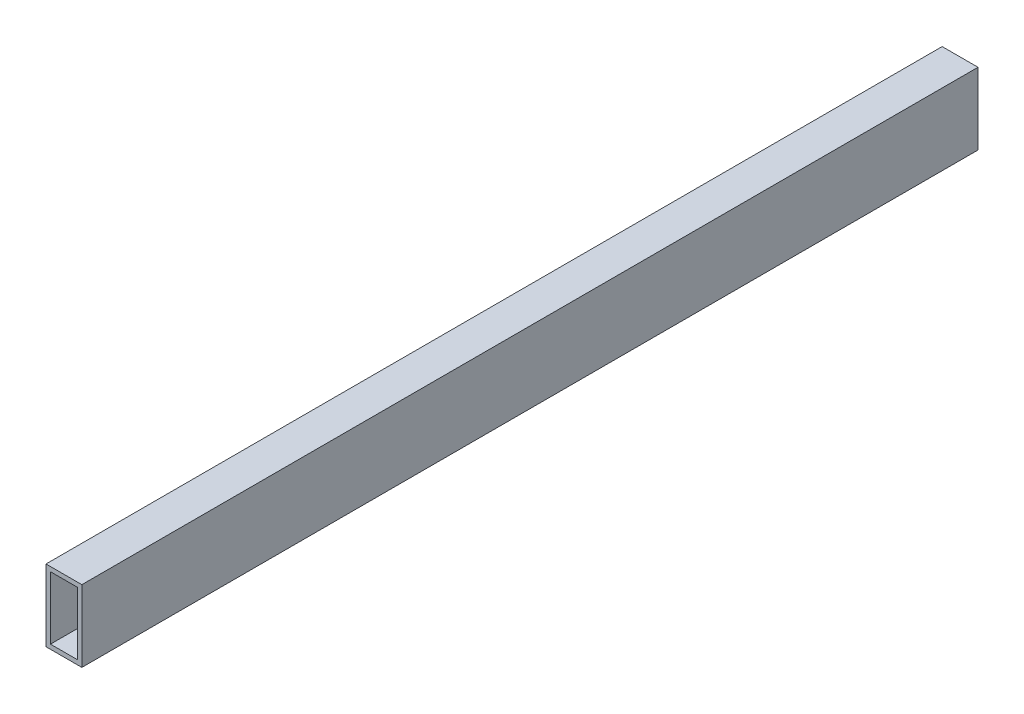
ISO-10303-21;
HEADER;
FILE_DESCRIPTION(('STEP AP214'),'2;1');
FILE_NAME('part.step','',(''),(''),'','','');
FILE_SCHEMA(('AUTOMOTIVE_DESIGN { 1 0 10303 214 1 1 1 1 }'));
ENDSEC;
DATA;
#1=APPLICATION_CONTEXT('core data for automotive mechanical design processes');
#2=APPLICATION_PROTOCOL_DEFINITION('international standard','automotive_design',2000,#1);
#3=PRODUCT_CONTEXT('',#1,'mechanical');
#4=PRODUCT('Part','Part','',(#3));
#5=PRODUCT_RELATED_PRODUCT_CATEGORY('part','',(#4));
#6=PRODUCT_DEFINITION_FORMATION('','',#4);
#7=PRODUCT_DEFINITION_CONTEXT('part definition',#1,'design');
#8=PRODUCT_DEFINITION('design','',#6,#7);
#9=PRODUCT_DEFINITION_SHAPE('','',#8);
#10=(LENGTH_UNIT() NAMED_UNIT(*) SI_UNIT(.MILLI.,.METRE.));
#11=(NAMED_UNIT(*) PLANE_ANGLE_UNIT() SI_UNIT($,.RADIAN.));
#12=(NAMED_UNIT(*) SI_UNIT($,.STERADIAN.) SOLID_ANGLE_UNIT());
#13=UNCERTAINTY_MEASURE_WITH_UNIT(LENGTH_MEASURE(1.E-05),#10,'distance_accuracy_value','');
#14=(GEOMETRIC_REPRESENTATION_CONTEXT(3) GLOBAL_UNCERTAINTY_ASSIGNED_CONTEXT((#13)) GLOBAL_UNIT_ASSIGNED_CONTEXT((#10,
#11,#12)) REPRESENTATION_CONTEXT('',''));
#15=CARTESIAN_POINT('',(0.,0.,0.));
#16=DIRECTION('',(0.,0.,1.));
#17=DIRECTION('',(1.,0.,0.));
#18=AXIS2_PLACEMENT_3D('',#15,#16,#17);
#19=CARTESIAN_POINT('',(0.,0.,635.));
#20=DIRECTION('',(0.,0.,-1.));
#21=DIRECTION('',(-1.,0.,0.));
#22=AXIS2_PLACEMENT_3D('',#19,#20,#21);
#23=PLANE('',#22);
#24=DIRECTION('',(0.,-1.,0.));
#25=VECTOR('',#24,1.);
#26=CARTESIAN_POINT('',(0.,0.,635.));
#27=LINE('',#26,#25);
#28=CARTESIAN_POINT('',(0.,50.8,635.));
#29=VERTEX_POINT('',#28);
#30=CARTESIAN_POINT('',(0.,0.,635.));
#31=VERTEX_POINT('',#30);
#32=EDGE_CURVE('E134',#29,#31,#27,.T.);
#33=ORIENTED_EDGE('',*,*,#32,.T.);
#34=DIRECTION('',(1.,0.,0.));
#35=VECTOR('',#34,1.);
#36=CARTESIAN_POINT('',(0.,0.,635.));
#37=LINE('',#36,#35);
#38=CARTESIAN_POINT('',(25.4,0.,635.));
#39=VERTEX_POINT('',#38);
#40=EDGE_CURVE('E137',#31,#39,#37,.T.);
#41=ORIENTED_EDGE('',*,*,#40,.T.);
#42=DIRECTION('',(0.,1.,0.));
#43=VECTOR('',#42,1.);
#44=CARTESIAN_POINT('',(25.4,0.,635.));
#45=LINE('',#44,#43);
#46=CARTESIAN_POINT('',(25.4,50.8,635.));
#47=VERTEX_POINT('',#46);
#48=EDGE_CURVE('E140',#39,#47,#45,.T.);
#49=ORIENTED_EDGE('',*,*,#48,.T.);
#50=DIRECTION('',(-1.,0.,0.));
#51=VECTOR('',#50,1.);
#52=CARTESIAN_POINT('',(0.,50.8,635.));
#53=LINE('',#52,#51);
#54=EDGE_CURVE('E142',#47,#29,#53,.T.);
#55=ORIENTED_EDGE('',*,*,#54,.T.);
#56=EDGE_LOOP('',(#33,#41,#49,#55));
#57=FACE_BOUND('',#56,.T.);
#58=DIRECTION('',(0.,-1.,0.));
#59=VECTOR('',#58,1.);
#60=CARTESIAN_POINT('',(3.175,3.175,635.));
#61=LINE('',#60,#59);
#62=CARTESIAN_POINT('',(3.175,47.625,635.));
#63=VERTEX_POINT('',#62);
#64=CARTESIAN_POINT('',(3.175,3.175,635.));
#65=VERTEX_POINT('',#64);
#66=EDGE_CURVE('E98',#63,#65,#61,.T.);
#67=ORIENTED_EDGE('',*,*,#66,.F.);
#68=DIRECTION('',(-1.,0.,0.));
#69=VECTOR('',#68,1.);
#70=CARTESIAN_POINT('',(3.175,47.625,635.));
#71=LINE('',#70,#69);
#72=CARTESIAN_POINT('',(22.225,47.625,635.));
#73=VERTEX_POINT('',#72);
#74=EDGE_CURVE('E120',#73,#63,#71,.T.);
#75=ORIENTED_EDGE('',*,*,#74,.F.);
#76=DIRECTION('',(0.,1.,0.));
#77=VECTOR('',#76,1.);
#78=CARTESIAN_POINT('',(22.225,3.175,635.));
#79=LINE('',#78,#77);
#80=CARTESIAN_POINT('',(22.225,3.175,635.));
#81=VERTEX_POINT('',#80);
#82=EDGE_CURVE('E118',#81,#73,#79,.T.);
#83=ORIENTED_EDGE('',*,*,#82,.F.);
#84=DIRECTION('',(1.,0.,0.));
#85=VECTOR('',#84,1.);
#86=CARTESIAN_POINT('',(3.175,3.175,635.));
#87=LINE('',#86,#85);
#88=EDGE_CURVE('E106',#65,#81,#87,.T.);
#89=ORIENTED_EDGE('',*,*,#88,.F.);
#90=EDGE_LOOP('',(#67,#75,#83,#89));
#91=FACE_BOUND('',#90,.T.);
#92=ADVANCED_FACE('F33',(#57,#91),#23,.F.);
#93=CARTESIAN_POINT('',(0.,0.,0.));
#94=DIRECTION('',(0.,0.,-1.));
#95=DIRECTION('',(-1.,0.,0.));
#96=AXIS2_PLACEMENT_3D('',#93,#94,#95);
#97=PLANE('',#96);
#98=DIRECTION('',(0.,-1.,0.));
#99=VECTOR('',#98,1.);
#100=CARTESIAN_POINT('',(0.,0.,0.));
#101=LINE('',#100,#99);
#102=CARTESIAN_POINT('',(0.,50.8,0.));
#103=VERTEX_POINT('',#102);
#104=CARTESIAN_POINT('',(0.,0.,0.));
#105=VERTEX_POINT('',#104);
#106=EDGE_CURVE('E114',#103,#105,#101,.T.);
#107=ORIENTED_EDGE('',*,*,#106,.F.);
#108=DIRECTION('',(-1.,0.,0.));
#109=VECTOR('',#108,1.);
#110=CARTESIAN_POINT('',(0.,50.8,0.));
#111=LINE('',#110,#109);
#112=CARTESIAN_POINT('',(25.4,50.8,0.));
#113=VERTEX_POINT('',#112);
#114=EDGE_CURVE('E138',#113,#103,#111,.T.);
#115=ORIENTED_EDGE('',*,*,#114,.F.);
#116=DIRECTION('',(0.,1.,0.));
#117=VECTOR('',#116,1.);
#118=CARTESIAN_POINT('',(25.4,0.,0.));
#119=LINE('',#118,#117);
#120=CARTESIAN_POINT('',(25.4,0.,0.));
#121=VERTEX_POINT('',#120);
#122=EDGE_CURVE('E149',#121,#113,#119,.T.);
#123=ORIENTED_EDGE('',*,*,#122,.F.);
#124=DIRECTION('',(1.,0.,0.));
#125=VECTOR('',#124,1.);
#126=CARTESIAN_POINT('',(0.,0.,0.));
#127=LINE('',#126,#125);
#128=EDGE_CURVE('E147',#105,#121,#127,.T.);
#129=ORIENTED_EDGE('',*,*,#128,.F.);
#130=EDGE_LOOP('',(#107,#115,#123,#129));
#131=FACE_BOUND('',#130,.T.);
#132=DIRECTION('',(-1.,0.,0.));
#133=VECTOR('',#132,1.);
#134=CARTESIAN_POINT('',(3.175,47.625,0.));
#135=LINE('',#134,#133);
#136=CARTESIAN_POINT('',(22.225,47.625,0.));
#137=VERTEX_POINT('',#136);
#138=CARTESIAN_POINT('',(3.175,47.625,0.));
#139=VERTEX_POINT('',#138);
#140=EDGE_CURVE('E107',#137,#139,#135,.T.);
#141=ORIENTED_EDGE('',*,*,#140,.T.);
#142=DIRECTION('',(0.,-1.,0.));
#143=VECTOR('',#142,1.);
#144=CARTESIAN_POINT('',(3.175,3.175,0.));
#145=LINE('',#144,#143);
#146=CARTESIAN_POINT('',(3.175,3.175,0.));
#147=VERTEX_POINT('',#146);
#148=EDGE_CURVE('E56',#139,#147,#145,.T.);
#149=ORIENTED_EDGE('',*,*,#148,.T.);
#150=DIRECTION('',(1.,0.,0.));
#151=VECTOR('',#150,1.);
#152=CARTESIAN_POINT('',(3.175,3.175,0.));
#153=LINE('',#152,#151);
#154=CARTESIAN_POINT('',(22.225,3.175,0.));
#155=VERTEX_POINT('',#154);
#156=EDGE_CURVE('E113',#147,#155,#153,.T.);
#157=ORIENTED_EDGE('',*,*,#156,.T.);
#158=DIRECTION('',(0.,1.,0.));
#159=VECTOR('',#158,1.);
#160=CARTESIAN_POINT('',(22.225,3.175,0.));
#161=LINE('',#160,#159);
#162=EDGE_CURVE('E126',#155,#137,#161,.T.);
#163=ORIENTED_EDGE('',*,*,#162,.T.);
#164=EDGE_LOOP('',(#141,#149,#157,#163));
#165=FACE_BOUND('',#164,.T.);
#166=ADVANCED_FACE('F167',(#131,#165),#97,.T.);
#167=CARTESIAN_POINT('',(0.,0.,635.));
#168=DIRECTION('',(1.,0.,0.));
#169=DIRECTION('',(0.,0.,-1.));
#170=AXIS2_PLACEMENT_3D('',#167,#168,#169);
#171=PLANE('',#170);
#172=ORIENTED_EDGE('',*,*,#106,.T.);
#173=DIRECTION('',(0.,0.,-1.));
#174=VECTOR('',#173,1.);
#175=CARTESIAN_POINT('',(0.,0.,635.));
#176=LINE('',#175,#174);
#177=EDGE_CURVE('E11',#31,#105,#176,.T.);
#178=ORIENTED_EDGE('',*,*,#177,.F.);
#179=ORIENTED_EDGE('',*,*,#32,.F.);
#180=DIRECTION('',(0.,0.,-1.));
#181=VECTOR('',#180,1.);
#182=CARTESIAN_POINT('',(0.,50.8,635.));
#183=LINE('',#182,#181);
#184=EDGE_CURVE('E144',#29,#103,#183,.T.);
#185=ORIENTED_EDGE('',*,*,#184,.T.);
#186=EDGE_LOOP('',(#172,#178,#179,#185));
#187=FACE_BOUND('',#186,.T.);
#188=ADVANCED_FACE('F35',(#187),#171,.F.);
#189=CARTESIAN_POINT('',(0.,0.,635.));
#190=DIRECTION('',(0.,1.,0.));
#191=DIRECTION('',(0.,0.,1.));
#192=AXIS2_PLACEMENT_3D('',#189,#190,#191);
#193=PLANE('',#192);
#194=ORIENTED_EDGE('',*,*,#128,.T.);
#195=DIRECTION('',(0.,0.,-1.));
#196=VECTOR('',#195,1.);
#197=CARTESIAN_POINT('',(25.4,0.,635.));
#198=LINE('',#197,#196);
#199=EDGE_CURVE('E41',#39,#121,#198,.T.);
#200=ORIENTED_EDGE('',*,*,#199,.F.);
#201=ORIENTED_EDGE('',*,*,#40,.F.);
#202=ORIENTED_EDGE('',*,*,#177,.T.);
#203=EDGE_LOOP('',(#194,#200,#201,#202));
#204=FACE_BOUND('',#203,.T.);
#205=ADVANCED_FACE('F177',(#204),#193,.F.);
#206=CARTESIAN_POINT('',(25.4,0.,635.));
#207=DIRECTION('',(-1.,0.,0.));
#208=DIRECTION('',(0.,0.,1.));
#209=AXIS2_PLACEMENT_3D('',#206,#207,#208);
#210=PLANE('',#209);
#211=ORIENTED_EDGE('',*,*,#122,.T.);
#212=DIRECTION('',(0.,0.,-1.));
#213=VECTOR('',#212,1.);
#214=CARTESIAN_POINT('',(25.4,50.8,635.));
#215=LINE('',#214,#213);
#216=EDGE_CURVE('E154',#47,#113,#215,.T.);
#217=ORIENTED_EDGE('',*,*,#216,.F.);
#218=ORIENTED_EDGE('',*,*,#48,.F.);
#219=ORIENTED_EDGE('',*,*,#199,.T.);
#220=EDGE_LOOP('',(#211,#217,#218,#219));
#221=FACE_BOUND('',#220,.T.);
#222=ADVANCED_FACE('F161',(#221),#210,.F.);
#223=CARTESIAN_POINT('',(0.,50.8,635.));
#224=DIRECTION('',(0.,-1.,0.));
#225=DIRECTION('',(0.,0.,-1.));
#226=AXIS2_PLACEMENT_3D('',#223,#224,#225);
#227=PLANE('',#226);
#228=ORIENTED_EDGE('',*,*,#114,.T.);
#229=ORIENTED_EDGE('',*,*,#184,.F.);
#230=ORIENTED_EDGE('',*,*,#54,.F.);
#231=ORIENTED_EDGE('',*,*,#216,.T.);
#232=EDGE_LOOP('',(#228,#229,#230,#231));
#233=FACE_BOUND('',#232,.T.);
#234=ADVANCED_FACE('F171',(#233),#227,.F.);
#235=CARTESIAN_POINT('',(3.175,3.175,635.));
#236=DIRECTION('',(1.,0.,0.));
#237=DIRECTION('',(0.,0.,-1.));
#238=AXIS2_PLACEMENT_3D('',#235,#236,#237);
#239=PLANE('',#238);
#240=ORIENTED_EDGE('',*,*,#148,.F.);
#241=DIRECTION('',(0.,0.,-1.));
#242=VECTOR('',#241,1.);
#243=CARTESIAN_POINT('',(3.175,47.625,635.));
#244=LINE('',#243,#242);
#245=EDGE_CURVE('E102',#63,#139,#244,.T.);
#246=ORIENTED_EDGE('',*,*,#245,.F.);
#247=ORIENTED_EDGE('',*,*,#66,.T.);
#248=DIRECTION('',(0.,0.,-1.));
#249=VECTOR('',#248,1.);
#250=CARTESIAN_POINT('',(3.175,3.175,635.));
#251=LINE('',#250,#249);
#252=EDGE_CURVE('E101',#65,#147,#251,.T.);
#253=ORIENTED_EDGE('',*,*,#252,.T.);
#254=EDGE_LOOP('',(#240,#246,#247,#253));
#255=FACE_BOUND('',#254,.T.);
#256=ADVANCED_FACE('F100',(#255),#239,.T.);
#257=CARTESIAN_POINT('',(3.175,3.175,635.));
#258=DIRECTION('',(0.,1.,0.));
#259=DIRECTION('',(0.,0.,1.));
#260=AXIS2_PLACEMENT_3D('',#257,#258,#259);
#261=PLANE('',#260);
#262=ORIENTED_EDGE('',*,*,#156,.F.);
#263=ORIENTED_EDGE('',*,*,#252,.F.);
#264=ORIENTED_EDGE('',*,*,#88,.T.);
#265=DIRECTION('',(0.,0.,-1.));
#266=VECTOR('',#265,1.);
#267=CARTESIAN_POINT('',(22.225,3.175,635.));
#268=LINE('',#267,#266);
#269=EDGE_CURVE('E115',#81,#155,#268,.T.);
#270=ORIENTED_EDGE('',*,*,#269,.T.);
#271=EDGE_LOOP('',(#262,#263,#264,#270));
#272=FACE_BOUND('',#271,.T.);
#273=ADVANCED_FACE('F110',(#272),#261,.T.);
#274=CARTESIAN_POINT('',(22.225,3.175,635.));
#275=DIRECTION('',(-1.,0.,0.));
#276=DIRECTION('',(0.,0.,1.));
#277=AXIS2_PLACEMENT_3D('',#274,#275,#276);
#278=PLANE('',#277);
#279=ORIENTED_EDGE('',*,*,#162,.F.);
#280=ORIENTED_EDGE('',*,*,#269,.F.);
#281=ORIENTED_EDGE('',*,*,#82,.T.);
#282=DIRECTION('',(0.,0.,-1.));
#283=VECTOR('',#282,1.);
#284=CARTESIAN_POINT('',(22.225,47.625,635.));
#285=LINE('',#284,#283);
#286=EDGE_CURVE('E48',#73,#137,#285,.T.);
#287=ORIENTED_EDGE('',*,*,#286,.T.);
#288=EDGE_LOOP('',(#279,#280,#281,#287));
#289=FACE_BOUND('',#288,.T.);
#290=ADVANCED_FACE('F200',(#289),#278,.T.);
#291=CARTESIAN_POINT('',(3.175,47.625,635.));
#292=DIRECTION('',(0.,-1.,0.));
#293=DIRECTION('',(0.,0.,-1.));
#294=AXIS2_PLACEMENT_3D('',#291,#292,#293);
#295=PLANE('',#294);
#296=ORIENTED_EDGE('',*,*,#140,.F.);
#297=ORIENTED_EDGE('',*,*,#286,.F.);
#298=ORIENTED_EDGE('',*,*,#74,.T.);
#299=ORIENTED_EDGE('',*,*,#245,.T.);
#300=EDGE_LOOP('',(#296,#297,#298,#299));
#301=FACE_BOUND('',#300,.T.);
#302=ADVANCED_FACE('F204',(#301),#295,.T.);
#303=CLOSED_SHELL('',(#92,#166,#188,#205,#222,#234,#256,#273,#290,#302));
#304=MANIFOLD_SOLID_BREP('B2',#303);
#305=ADVANCED_BREP_SHAPE_REPRESENTATION('',(#18,#304),#14);
#306=SHAPE_DEFINITION_REPRESENTATION(#9,#305);
ENDSEC;
END-ISO-10303-21;
